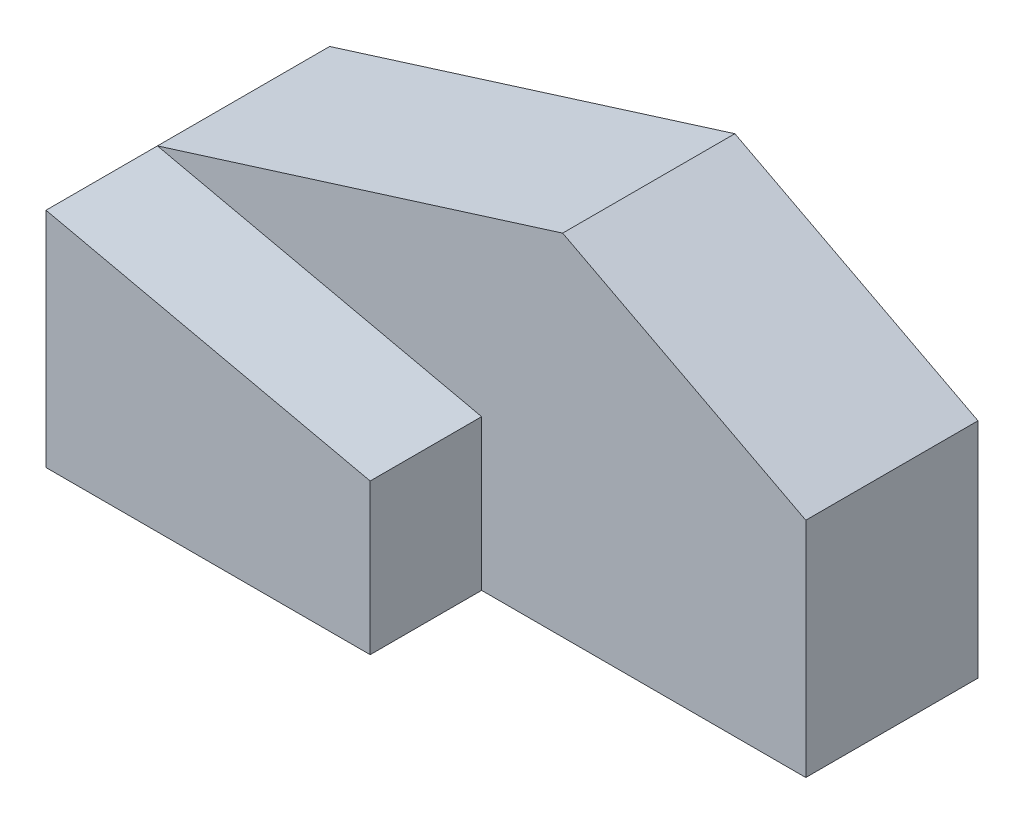
ISO-10303-21;
HEADER;
FILE_DESCRIPTION(('STEP AP214'),'2;1');
FILE_NAME('part.step','',(''),(''),'','','');
FILE_SCHEMA(('AUTOMOTIVE_DESIGN { 1 0 10303 214 1 1 1 1 }'));
ENDSEC;
DATA;
#1=APPLICATION_CONTEXT('core data for automotive mechanical design processes');
#2=APPLICATION_PROTOCOL_DEFINITION('international standard','automotive_design',2000,#1);
#3=PRODUCT_CONTEXT('',#1,'mechanical');
#4=PRODUCT('Part','Part','',(#3));
#5=PRODUCT_RELATED_PRODUCT_CATEGORY('part','',(#4));
#6=PRODUCT_DEFINITION_FORMATION('','',#4);
#7=PRODUCT_DEFINITION_CONTEXT('part definition',#1,'design');
#8=PRODUCT_DEFINITION('design','',#6,#7);
#9=PRODUCT_DEFINITION_SHAPE('','',#8);
#10=(LENGTH_UNIT() NAMED_UNIT(*) SI_UNIT(.MILLI.,.METRE.));
#11=(NAMED_UNIT(*) PLANE_ANGLE_UNIT() SI_UNIT($,.RADIAN.));
#12=(NAMED_UNIT(*) SI_UNIT($,.STERADIAN.) SOLID_ANGLE_UNIT());
#13=UNCERTAINTY_MEASURE_WITH_UNIT(LENGTH_MEASURE(1.E-05),#10,'distance_accuracy_value','');
#14=(GEOMETRIC_REPRESENTATION_CONTEXT(3) GLOBAL_UNCERTAINTY_ASSIGNED_CONTEXT((#13)) GLOBAL_UNIT_ASSIGNED_CONTEXT((#10,
#11,#12)) REPRESENTATION_CONTEXT('',''));
#15=CARTESIAN_POINT('',(0.,0.,0.));
#16=DIRECTION('',(0.,0.,1.));
#17=DIRECTION('',(1.,0.,0.));
#18=AXIS2_PLACEMENT_3D('',#15,#16,#17);
#19=CARTESIAN_POINT('',(0.,0.,26.9875));
#20=DIRECTION('',(0.,0.,1.));
#21=DIRECTION('',(1.,0.,0.));
#22=AXIS2_PLACEMENT_3D('',#19,#20,#21);
#23=PLANE('',#22);
#24=DIRECTION('',(0.954193519511046,0.299190119026555,0.));
#25=VECTOR('',#24,1.);
#26=CARTESIAN_POINT('',(-4.5473481480147,14.5026518519853,26.9875));
#27=LINE('',#26,#25);
#28=CARTESIAN_POINT('',(-50.8,0.,26.9875));
#29=VERTEX_POINT('',#28);
#30=CARTESIAN_POINT('',(12.7,19.9106074079413,26.9875));
#31=VERTEX_POINT('',#30);
#32=EDGE_CURVE('E143',#29,#31,#27,.T.);
#33=ORIENTED_EDGE('',*,*,#32,.F.);
#34=DIRECTION('',(0.975950887536325,-0.217990516117238,0.));
#35=VECTOR('',#34,1.);
#36=CARTESIAN_POINT('',(-50.8,0.,26.9875));
#37=LINE('',#36,#35);
#38=CARTESIAN_POINT('',(0.,-11.34679865573,26.9875));
#39=VERTEX_POINT('',#38);
#40=EDGE_CURVE('E127',#29,#39,#37,.T.);
#41=ORIENTED_EDGE('',*,*,#40,.T.);
#42=DIRECTION('',(0.,-1.,0.));
#43=VECTOR('',#42,1.);
#44=CARTESIAN_POINT('',(0.,-11.34679865573,26.9875));
#45=LINE('',#44,#43);
#46=CARTESIAN_POINT('',(0.,-34.925,26.9875));
#47=VERTEX_POINT('',#46);
#48=EDGE_CURVE('E125',#39,#47,#45,.T.);
#49=ORIENTED_EDGE('',*,*,#48,.T.);
#50=DIRECTION('',(1.,0.,0.));
#51=VECTOR('',#50,1.);
#52=CARTESIAN_POINT('',(0.,-34.925,26.9875));
#53=LINE('',#52,#51);
#54=CARTESIAN_POINT('',(50.8,-34.925,26.9875));
#55=VERTEX_POINT('',#54);
#56=EDGE_CURVE('E147',#47,#55,#53,.T.);
#57=ORIENTED_EDGE('',*,*,#56,.T.);
#58=DIRECTION('',(0.,1.,0.));
#59=VECTOR('',#58,1.);
#60=CARTESIAN_POINT('',(50.8,0.,26.9875));
#61=LINE('',#60,#59);
#62=CARTESIAN_POINT('',(50.8,0.,26.9875));
#63=VERTEX_POINT('',#62);
#64=EDGE_CURVE('E59',#55,#63,#61,.T.);
#65=ORIENTED_EDGE('',*,*,#64,.T.);
#66=DIRECTION('',(0.886276070238205,-0.463157346182833,0.));
#67=VECTOR('',#66,1.);
#68=CARTESIAN_POINT('',(10.8973481480147,20.8526518519853,26.9875));
#69=LINE('',#68,#67);
#70=EDGE_CURVE('E141',#31,#63,#69,.T.);
#71=ORIENTED_EDGE('',*,*,#70,.F.);
#72=EDGE_LOOP('',(#33,#41,#49,#57,#65,#71));
#73=FACE_BOUND('',#72,.T.);
#74=ADVANCED_FACE('F35',(#73),#23,.T.);
#75=CARTESIAN_POINT('',(10.8973481480147,20.8526518519853,26.9875));
#76=DIRECTION('',(0.463157346182833,0.886276070238205,0.));
#77=DIRECTION('',(-0.886276070238205,0.463157346182833,0.));
#78=AXIS2_PLACEMENT_3D('',#75,#76,#77);
#79=PLANE('',#78);
#80=DIRECTION('',(0.886276070238205,-0.463157346182833,0.));
#81=VECTOR('',#80,1.);
#82=CARTESIAN_POINT('',(10.8973481480147,20.8526518519853,0.));
#83=LINE('',#82,#81);
#84=CARTESIAN_POINT('',(12.7,19.9106074079413,0.));
#85=VERTEX_POINT('',#84);
#86=CARTESIAN_POINT('',(50.8,0.,0.));
#87=VERTEX_POINT('',#86);
#88=EDGE_CURVE('E137',#85,#87,#83,.T.);
#89=ORIENTED_EDGE('',*,*,#88,.F.);
#90=DIRECTION('',(0.,0.,-1.));
#91=VECTOR('',#90,1.);
#92=CARTESIAN_POINT('',(12.7,19.9106074079413,26.9875));
#93=LINE('',#92,#91);
#94=EDGE_CURVE('E11',#31,#85,#93,.T.);
#95=ORIENTED_EDGE('',*,*,#94,.F.);
#96=ORIENTED_EDGE('',*,*,#70,.T.);
#97=DIRECTION('',(0.,0.,-1.));
#98=VECTOR('',#97,1.);
#99=CARTESIAN_POINT('',(50.8,0.,26.9875));
#100=LINE('',#99,#98);
#101=EDGE_CURVE('E81',#63,#87,#100,.T.);
#102=ORIENTED_EDGE('',*,*,#101,.T.);
#103=EDGE_LOOP('',(#89,#95,#96,#102));
#104=FACE_BOUND('',#103,.T.);
#105=ADVANCED_FACE('F37',(#104),#79,.T.);
#106=CARTESIAN_POINT('',(-4.5473481480147,14.5026518519853,26.9875));
#107=DIRECTION('',(-0.299190119026555,0.954193519511046,0.));
#108=DIRECTION('',(-0.954193519511046,-0.299190119026555,0.));
#109=AXIS2_PLACEMENT_3D('',#106,#107,#108);
#110=PLANE('',#109);
#111=DIRECTION('',(0.954193519511046,0.299190119026555,0.));
#112=VECTOR('',#111,1.);
#113=CARTESIAN_POINT('',(-4.5473481480147,14.5026518519853,0.));
#114=LINE('',#113,#112);
#115=CARTESIAN_POINT('',(-50.8,0.,0.));
#116=VERTEX_POINT('',#115);
#117=EDGE_CURVE('E152',#116,#85,#114,.T.);
#118=ORIENTED_EDGE('',*,*,#117,.F.);
#119=DIRECTION('',(0.,0.,-1.));
#120=VECTOR('',#119,1.);
#121=CARTESIAN_POINT('',(-50.8,0.,26.9875));
#122=LINE('',#121,#120);
#123=EDGE_CURVE('E43',#29,#116,#122,.T.);
#124=ORIENTED_EDGE('',*,*,#123,.F.);
#125=ORIENTED_EDGE('',*,*,#32,.T.);
#126=ORIENTED_EDGE('',*,*,#94,.T.);
#127=EDGE_LOOP('',(#118,#124,#125,#126));
#128=FACE_BOUND('',#127,.T.);
#129=ADVANCED_FACE('F169',(#128),#110,.T.);
#130=CARTESIAN_POINT('',(-50.8,0.,26.9875));
#131=DIRECTION('',(1.,0.,0.));
#132=DIRECTION('',(0.,1.,0.));
#133=AXIS2_PLACEMENT_3D('',#130,#131,#132);
#134=PLANE('',#133);
#135=DIRECTION('',(0.,-1.,0.));
#136=VECTOR('',#135,1.);
#137=CARTESIAN_POINT('',(-50.8,0.,0.));
#138=LINE('',#137,#136);
#139=CARTESIAN_POINT('',(-50.8,-34.925,0.));
#140=VERTEX_POINT('',#139);
#141=EDGE_CURVE('E108',#116,#140,#138,.T.);
#142=ORIENTED_EDGE('',*,*,#141,.T.);
#143=DIRECTION('',(0.,0.,-1.));
#144=VECTOR('',#143,1.);
#145=CARTESIAN_POINT('',(-50.8,-34.925,26.9875));
#146=LINE('',#145,#144);
#147=CARTESIAN_POINT('',(-50.8,-34.925,44.45));
#148=VERTEX_POINT('',#147);
#149=EDGE_CURVE('E103',#148,#140,#146,.T.);
#150=ORIENTED_EDGE('',*,*,#149,.F.);
#151=DIRECTION('',(0.,1.,0.));
#152=VECTOR('',#151,1.);
#153=CARTESIAN_POINT('',(-50.8,-34.925,44.45));
#154=LINE('',#153,#152);
#155=CARTESIAN_POINT('',(-50.8,0.,44.45));
#156=VERTEX_POINT('',#155);
#157=EDGE_CURVE('E106',#148,#156,#154,.T.);
#158=ORIENTED_EDGE('',*,*,#157,.T.);
#159=DIRECTION('',(0.,0.,-1.));
#160=VECTOR('',#159,1.);
#161=CARTESIAN_POINT('',(-50.8,0.,44.45));
#162=LINE('',#161,#160);
#163=EDGE_CURVE('E133',#156,#29,#162,.T.);
#164=ORIENTED_EDGE('',*,*,#163,.T.);
#165=ORIENTED_EDGE('',*,*,#123,.T.);
#166=EDGE_LOOP('',(#142,#150,#158,#164,#165));
#167=FACE_BOUND('',#166,.T.);
#168=ADVANCED_FACE('F105',(#167),#134,.F.);
#169=CARTESIAN_POINT('',(0.,-34.925,26.9875));
#170=DIRECTION('',(0.,1.,0.));
#171=DIRECTION('',(0.,0.,1.));
#172=AXIS2_PLACEMENT_3D('',#169,#170,#171);
#173=PLANE('',#172);
#174=DIRECTION('',(1.,0.,0.));
#175=VECTOR('',#174,1.);
#176=CARTESIAN_POINT('',(0.,-34.925,0.));
#177=LINE('',#176,#175);
#178=CARTESIAN_POINT('',(50.8,-34.925,0.));
#179=VERTEX_POINT('',#178);
#180=EDGE_CURVE('E156',#140,#179,#177,.T.);
#181=ORIENTED_EDGE('',*,*,#180,.T.);
#182=DIRECTION('',(0.,0.,-1.));
#183=VECTOR('',#182,1.);
#184=CARTESIAN_POINT('',(50.8,-34.925,26.9875));
#185=LINE('',#184,#183);
#186=EDGE_CURVE('E112',#55,#179,#185,.T.);
#187=ORIENTED_EDGE('',*,*,#186,.F.);
#188=ORIENTED_EDGE('',*,*,#56,.F.);
#189=DIRECTION('',(0.,0.,-1.));
#190=VECTOR('',#189,1.);
#191=CARTESIAN_POINT('',(0.,-34.925,44.45));
#192=LINE('',#191,#190);
#193=CARTESIAN_POINT('',(0.,-34.925,44.45));
#194=VERTEX_POINT('',#193);
#195=EDGE_CURVE('E50',#194,#47,#192,.T.);
#196=ORIENTED_EDGE('',*,*,#195,.F.);
#197=DIRECTION('',(-1.,0.,0.));
#198=VECTOR('',#197,1.);
#199=CARTESIAN_POINT('',(0.,-34.925,44.45));
#200=LINE('',#199,#198);
#201=EDGE_CURVE('E119',#194,#148,#200,.T.);
#202=ORIENTED_EDGE('',*,*,#201,.T.);
#203=ORIENTED_EDGE('',*,*,#149,.T.);
#204=EDGE_LOOP('',(#181,#187,#188,#196,#202,#203));
#205=FACE_BOUND('',#204,.T.);
#206=ADVANCED_FACE('F123',(#205),#173,.F.);
#207=CARTESIAN_POINT('',(50.8,0.,26.9875));
#208=DIRECTION('',(-1.,0.,0.));
#209=DIRECTION('',(0.,0.,1.));
#210=AXIS2_PLACEMENT_3D('',#207,#208,#209);
#211=PLANE('',#210);
#212=DIRECTION('',(0.,1.,0.));
#213=VECTOR('',#212,1.);
#214=CARTESIAN_POINT('',(50.8,0.,0.));
#215=LINE('',#214,#213);
#216=EDGE_CURVE('E144',#179,#87,#215,.T.);
#217=ORIENTED_EDGE('',*,*,#216,.T.);
#218=ORIENTED_EDGE('',*,*,#101,.F.);
#219=ORIENTED_EDGE('',*,*,#64,.F.);
#220=ORIENTED_EDGE('',*,*,#186,.T.);
#221=EDGE_LOOP('',(#217,#218,#219,#220));
#222=FACE_BOUND('',#221,.T.);
#223=ADVANCED_FACE('F171',(#222),#211,.F.);
#224=CARTESIAN_POINT('',(0.,0.,0.));
#225=DIRECTION('',(0.,0.,1.));
#226=DIRECTION('',(1.,0.,0.));
#227=AXIS2_PLACEMENT_3D('',#224,#225,#226);
#228=PLANE('',#227);
#229=ORIENTED_EDGE('',*,*,#88,.T.);
#230=ORIENTED_EDGE('',*,*,#216,.F.);
#231=ORIENTED_EDGE('',*,*,#180,.F.);
#232=ORIENTED_EDGE('',*,*,#141,.F.);
#233=ORIENTED_EDGE('',*,*,#117,.T.);
#234=EDGE_LOOP('',(#229,#230,#231,#232,#233));
#235=FACE_BOUND('',#234,.T.);
#236=ADVANCED_FACE('F167',(#235),#228,.F.);
#237=CARTESIAN_POINT('',(0.,-11.34679865573,44.45));
#238=DIRECTION('',(1.,0.,0.));
#239=DIRECTION('',(0.,0.,-1.));
#240=AXIS2_PLACEMENT_3D('',#237,#238,#239);
#241=PLANE('',#240);
#242=ORIENTED_EDGE('',*,*,#48,.F.);
#243=DIRECTION('',(0.,0.,-1.));
#244=VECTOR('',#243,1.);
#245=CARTESIAN_POINT('',(0.,-11.34679865573,44.45));
#246=LINE('',#245,#244);
#247=CARTESIAN_POINT('',(0.,-11.34679865573,44.45));
#248=VERTEX_POINT('',#247);
#249=EDGE_CURVE('E138',#248,#39,#246,.T.);
#250=ORIENTED_EDGE('',*,*,#249,.F.);
#251=DIRECTION('',(0.,-1.,0.));
#252=VECTOR('',#251,1.);
#253=CARTESIAN_POINT('',(0.,-11.34679865573,44.45));
#254=LINE('',#253,#252);
#255=EDGE_CURVE('E131',#248,#194,#254,.T.);
#256=ORIENTED_EDGE('',*,*,#255,.T.);
#257=ORIENTED_EDGE('',*,*,#195,.T.);
#258=EDGE_LOOP('',(#242,#250,#256,#257));
#259=FACE_BOUND('',#258,.T.);
#260=ADVANCED_FACE('F173',(#259),#241,.T.);
#261=CARTESIAN_POINT('',(-50.8,0.,44.45));
#262=DIRECTION('',(0.217990516117238,0.975950887536325,0.));
#263=DIRECTION('',(-0.975950887536325,0.217990516117238,0.));
#264=AXIS2_PLACEMENT_3D('',#261,#262,#263);
#265=PLANE('',#264);
#266=ORIENTED_EDGE('',*,*,#40,.F.);
#267=ORIENTED_EDGE('',*,*,#163,.F.);
#268=DIRECTION('',(0.975950887536325,-0.217990516117238,0.));
#269=VECTOR('',#268,1.);
#270=CARTESIAN_POINT('',(-50.8,0.,44.45));
#271=LINE('',#270,#269);
#272=EDGE_CURVE('E121',#156,#248,#271,.T.);
#273=ORIENTED_EDGE('',*,*,#272,.T.);
#274=ORIENTED_EDGE('',*,*,#249,.T.);
#275=EDGE_LOOP('',(#266,#267,#273,#274));
#276=FACE_BOUND('',#275,.T.);
#277=ADVANCED_FACE('F175',(#276),#265,.T.);
#278=CARTESIAN_POINT('',(0.,0.,44.45));
#279=DIRECTION('',(0.,0.,-1.));
#280=DIRECTION('',(-1.,0.,0.));
#281=AXIS2_PLACEMENT_3D('',#278,#279,#280);
#282=PLANE('',#281);
#283=ORIENTED_EDGE('',*,*,#201,.F.);
#284=ORIENTED_EDGE('',*,*,#255,.F.);
#285=ORIENTED_EDGE('',*,*,#272,.F.);
#286=ORIENTED_EDGE('',*,*,#157,.F.);
#287=EDGE_LOOP('',(#283,#284,#285,#286));
#288=FACE_BOUND('',#287,.T.);
#289=ADVANCED_FACE('F117',(#288),#282,.F.);
#290=CLOSED_SHELL('',(#74,#105,#129,#168,#206,#223,#236,#260,#277,#289));
#291=MANIFOLD_SOLID_BREP('B2',#290);
#292=ADVANCED_BREP_SHAPE_REPRESENTATION('',(#18,#291),#14);
#293=SHAPE_DEFINITION_REPRESENTATION(#9,#292);
ENDSEC;
END-ISO-10303-21;
